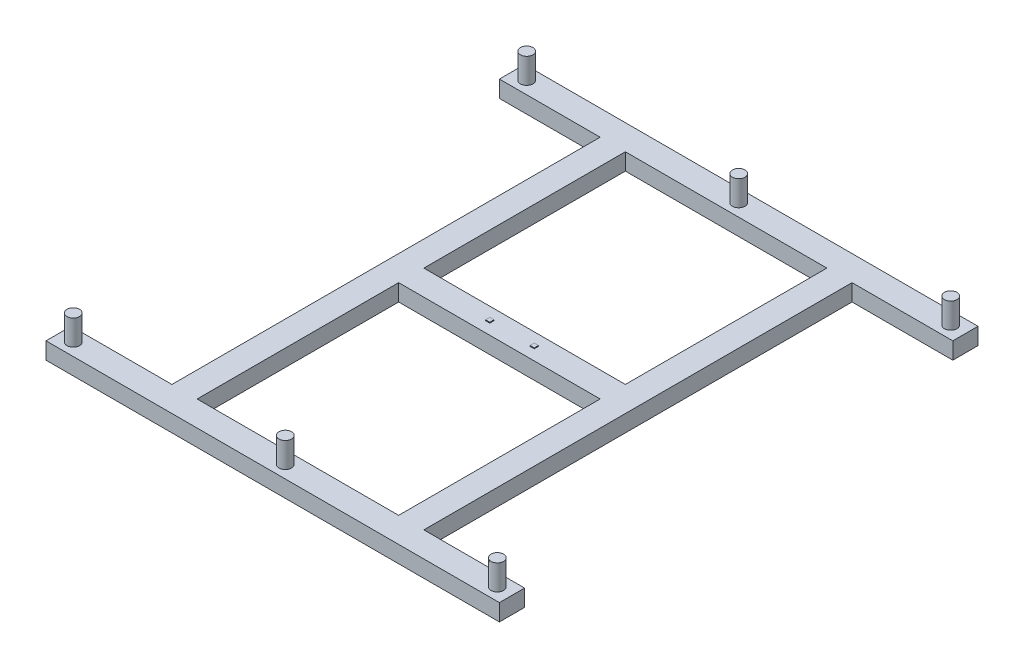
ISO-10303-21;
HEADER;
FILE_DESCRIPTION(('STEP AP214'),'2;1');
FILE_NAME('part.step','',(''),(''),'','','');
FILE_SCHEMA(('AUTOMOTIVE_DESIGN { 1 0 10303 214 1 1 1 1 }'));
ENDSEC;
DATA;
#1=APPLICATION_CONTEXT('core data for automotive mechanical design processes');
#2=APPLICATION_PROTOCOL_DEFINITION('international standard','automotive_design',2000,#1);
#3=PRODUCT_CONTEXT('',#1,'mechanical');
#4=PRODUCT('Part','Part','',(#3));
#5=PRODUCT_RELATED_PRODUCT_CATEGORY('part','',(#4));
#6=PRODUCT_DEFINITION_FORMATION('','',#4);
#7=PRODUCT_DEFINITION_CONTEXT('part definition',#1,'design');
#8=PRODUCT_DEFINITION('design','',#6,#7);
#9=PRODUCT_DEFINITION_SHAPE('','',#8);
#10=(LENGTH_UNIT() NAMED_UNIT(*) SI_UNIT(.MILLI.,.METRE.));
#11=(NAMED_UNIT(*) PLANE_ANGLE_UNIT() SI_UNIT($,.RADIAN.));
#12=(NAMED_UNIT(*) SI_UNIT($,.STERADIAN.) SOLID_ANGLE_UNIT());
#13=UNCERTAINTY_MEASURE_WITH_UNIT(LENGTH_MEASURE(1.E-05),#10,'distance_accuracy_value','');
#14=(GEOMETRIC_REPRESENTATION_CONTEXT(3) GLOBAL_UNCERTAINTY_ASSIGNED_CONTEXT((#13)) GLOBAL_UNIT_ASSIGNED_CONTEXT((#10,
#11,#12)) REPRESENTATION_CONTEXT('',''));
#15=CARTESIAN_POINT('',(0.,0.,0.));
#16=DIRECTION('',(0.,0.,1.));
#17=DIRECTION('',(1.,0.,0.));
#18=AXIS2_PLACEMENT_3D('',#15,#16,#17);
#19=CARTESIAN_POINT('',(0.,20.,0.));
#20=DIRECTION('',(0.,1.,0.));
#21=DIRECTION('',(0.,0.,1.));
#22=AXIS2_PLACEMENT_3D('',#19,#20,#21);
#23=PLANE('',#22);
#24=CARTESIAN_POINT('',(252.5,20.,270.));
#25=DIRECTION('',(0.,1.,0.));
#26=DIRECTION('',(0.,0.,1.));
#27=AXIS2_PLACEMENT_3D('',#24,#25,#26);
#28=CIRCLE('',#27,7.50000000000001);
#29=CARTESIAN_POINT('',(252.5,20.,277.5));
#30=VERTEX_POINT('',#29);
#31=EDGE_CURVE('E313',#30,#30,#28,.T.);
#32=ORIENTED_EDGE('',*,*,#31,.F.);
#33=EDGE_LOOP('',(#32));
#34=FACE_BOUND('',#33,.T.);
#35=CARTESIAN_POINT('',(0.,20.,270.));
#36=DIRECTION('',(0.,1.,0.));
#37=DIRECTION('',(0.,0.,1.));
#38=AXIS2_PLACEMENT_3D('',#35,#36,#37);
#39=CIRCLE('',#38,7.50000000000001);
#40=CARTESIAN_POINT('',(0.,20.,277.5));
#41=VERTEX_POINT('',#40);
#42=EDGE_CURVE('E321',#41,#41,#39,.T.);
#43=ORIENTED_EDGE('',*,*,#42,.F.);
#44=EDGE_LOOP('',(#43));
#45=FACE_BOUND('',#44,.T.);
#46=CARTESIAN_POINT('',(-252.5,20.,270.));
#47=DIRECTION('',(0.,1.,0.));
#48=DIRECTION('',(0.,0.,1.));
#49=AXIS2_PLACEMENT_3D('',#46,#47,#48);
#50=CIRCLE('',#49,7.50000000000001);
#51=CARTESIAN_POINT('',(-252.5,20.,277.5));
#52=VERTEX_POINT('',#51);
#53=EDGE_CURVE('E329',#52,#52,#50,.T.);
#54=ORIENTED_EDGE('',*,*,#53,.F.);
#55=EDGE_LOOP('',(#54));
#56=FACE_BOUND('',#55,.T.);
#57=CARTESIAN_POINT('',(252.5,20.,-270.));
#58=DIRECTION('',(0.,1.,0.));
#59=DIRECTION('',(0.,0.,1.));
#60=AXIS2_PLACEMENT_3D('',#57,#58,#59);
#61=CIRCLE('',#60,7.50000000000001);
#62=CARTESIAN_POINT('',(252.5,20.,-262.5));
#63=VERTEX_POINT('',#62);
#64=EDGE_CURVE('E337',#63,#63,#61,.T.);
#65=ORIENTED_EDGE('',*,*,#64,.F.);
#66=EDGE_LOOP('',(#65));
#67=FACE_BOUND('',#66,.T.);
#68=CARTESIAN_POINT('',(0.,20.,-270.));
#69=DIRECTION('',(0.,1.,0.));
#70=DIRECTION('',(0.,0.,1.));
#71=AXIS2_PLACEMENT_3D('',#68,#69,#70);
#72=CIRCLE('',#71,7.5);
#73=CARTESIAN_POINT('',(0.,20.,-262.5));
#74=VERTEX_POINT('',#73);
#75=EDGE_CURVE('E345',#74,#74,#72,.T.);
#76=ORIENTED_EDGE('',*,*,#75,.F.);
#77=EDGE_LOOP('',(#76));
#78=FACE_BOUND('',#77,.T.);
#79=CARTESIAN_POINT('',(-252.5,20.,-270.));
#80=DIRECTION('',(0.,1.,0.));
#81=DIRECTION('',(0.,0.,1.));
#82=AXIS2_PLACEMENT_3D('',#79,#80,#81);
#83=CIRCLE('',#82,7.50000000000001);
#84=CARTESIAN_POINT('',(-252.5,20.,-262.5));
#85=VERTEX_POINT('',#84);
#86=EDGE_CURVE('E349',#85,#85,#83,.T.);
#87=ORIENTED_EDGE('',*,*,#86,.F.);
#88=EDGE_LOOP('',(#87));
#89=FACE_BOUND('',#88,.T.);
#90=DIRECTION('',(0.,0.,1.));
#91=VECTOR('',#90,1.);
#92=CARTESIAN_POINT('',(150.,20.,0.));
#93=LINE('',#92,#91);
#94=CARTESIAN_POINT('',(150.,20.,-255.));
#95=VERTEX_POINT('',#94);
#96=CARTESIAN_POINT('',(150.,20.,255.));
#97=VERTEX_POINT('',#96);
#98=EDGE_CURVE('E465',#95,#97,#93,.T.);
#99=ORIENTED_EDGE('',*,*,#98,.F.);
#100=DIRECTION('',(1.,0.,0.));
#101=VECTOR('',#100,1.);
#102=CARTESIAN_POINT('',(0.,20.,-255.));
#103=LINE('',#102,#101);
#104=CARTESIAN_POINT('',(270.,20.,-255.));
#105=VERTEX_POINT('',#104);
#106=EDGE_CURVE('E443',#95,#105,#103,.T.);
#107=ORIENTED_EDGE('',*,*,#106,.T.);
#108=DIRECTION('',(0.,0.,1.));
#109=VECTOR('',#108,1.);
#110=CARTESIAN_POINT('',(269.999999999999,20.,4.9960036108132E-13));
#111=LINE('',#110,#109);
#112=CARTESIAN_POINT('',(270.,20.,-285.));
#113=VERTEX_POINT('',#112);
#114=EDGE_CURVE('E439',#113,#105,#111,.T.);
#115=ORIENTED_EDGE('',*,*,#114,.F.);
#116=DIRECTION('',(1.,0.,0.));
#117=VECTOR('',#116,1.);
#118=CARTESIAN_POINT('',(0.,20.,-285.));
#119=LINE('',#118,#117);
#120=CARTESIAN_POINT('',(-270.,20.,-285.));
#121=VERTEX_POINT('',#120);
#122=EDGE_CURVE('E469',#121,#113,#119,.T.);
#123=ORIENTED_EDGE('',*,*,#122,.F.);
#124=DIRECTION('',(0.,0.,1.));
#125=VECTOR('',#124,1.);
#126=CARTESIAN_POINT('',(-270.,20.,0.));
#127=LINE('',#126,#125);
#128=CARTESIAN_POINT('',(-270.,20.,-255.));
#129=VERTEX_POINT('',#128);
#130=EDGE_CURVE('E413',#121,#129,#127,.T.);
#131=ORIENTED_EDGE('',*,*,#130,.T.);
#132=DIRECTION('',(-1.,0.,0.));
#133=VECTOR('',#132,1.);
#134=CARTESIAN_POINT('',(0.,20.,-255.));
#135=LINE('',#134,#133);
#136=CARTESIAN_POINT('',(-150.,20.,-255.));
#137=VERTEX_POINT('',#136);
#138=EDGE_CURVE('E416',#137,#129,#135,.T.);
#139=ORIENTED_EDGE('',*,*,#138,.F.);
#140=DIRECTION('',(0.,0.,1.));
#141=VECTOR('',#140,1.);
#142=CARTESIAN_POINT('',(-150.,20.,0.));
#143=LINE('',#142,#141);
#144=CARTESIAN_POINT('',(-150.,20.,255.));
#145=VERTEX_POINT('',#144);
#146=EDGE_CURVE('E473',#137,#145,#143,.T.);
#147=ORIENTED_EDGE('',*,*,#146,.T.);
#148=DIRECTION('',(-1.,0.,0.));
#149=VECTOR('',#148,1.);
#150=CARTESIAN_POINT('',(0.,20.,255.));
#151=LINE('',#150,#149);
#152=CARTESIAN_POINT('',(-270.,20.,255.));
#153=VERTEX_POINT('',#152);
#154=EDGE_CURVE('E391',#145,#153,#151,.T.);
#155=ORIENTED_EDGE('',*,*,#154,.T.);
#156=DIRECTION('',(0.,0.,-1.));
#157=VECTOR('',#156,1.);
#158=CARTESIAN_POINT('',(-270.,20.,0.));
#159=LINE('',#158,#157);
#160=CARTESIAN_POINT('',(-270.,20.,285.));
#161=VERTEX_POINT('',#160);
#162=EDGE_CURVE('E387',#161,#153,#159,.T.);
#163=ORIENTED_EDGE('',*,*,#162,.F.);
#164=DIRECTION('',(1.,0.,0.));
#165=VECTOR('',#164,1.);
#166=CARTESIAN_POINT('',(0.,20.,285.));
#167=LINE('',#166,#165);
#168=CARTESIAN_POINT('',(270.,20.,285.));
#169=VERTEX_POINT('',#168);
#170=EDGE_CURVE('E477',#161,#169,#167,.T.);
#171=ORIENTED_EDGE('',*,*,#170,.T.);
#172=DIRECTION('',(0.,0.,-1.));
#173=VECTOR('',#172,1.);
#174=CARTESIAN_POINT('',(270.,20.,0.));
#175=LINE('',#174,#173);
#176=CARTESIAN_POINT('',(270.,20.,255.));
#177=VERTEX_POINT('',#176);
#178=EDGE_CURVE('E361',#169,#177,#175,.T.);
#179=ORIENTED_EDGE('',*,*,#178,.T.);
#180=DIRECTION('',(1.,0.,0.));
#181=VECTOR('',#180,1.);
#182=CARTESIAN_POINT('',(0.,20.,255.));
#183=LINE('',#182,#181);
#184=EDGE_CURVE('E364',#97,#177,#183,.T.);
#185=ORIENTED_EDGE('',*,*,#184,.F.);
#186=EDGE_LOOP('',(#99,#107,#115,#123,#131,#139,#147,#155,#163,#171,#179,#185));
#187=FACE_BOUND('',#186,.T.);
#188=DIRECTION('',(1.,0.,0.));
#189=VECTOR('',#188,1.);
#190=CARTESIAN_POINT('',(0.,20.,-255.));
#191=LINE('',#190,#189);
#192=CARTESIAN_POINT('',(-120.,20.,-255.));
#193=VERTEX_POINT('',#192);
#194=CARTESIAN_POINT('',(120.,20.,-255.));
#195=VERTEX_POINT('',#194);
#196=EDGE_CURVE('E480',#193,#195,#191,.T.);
#197=ORIENTED_EDGE('',*,*,#196,.T.);
#198=DIRECTION('',(0.,0.,1.));
#199=VECTOR('',#198,1.);
#200=CARTESIAN_POINT('',(120.,20.,0.));
#201=LINE('',#200,#199);
#202=CARTESIAN_POINT('',(120.,20.,-15.0000000000001));
#203=VERTEX_POINT('',#202);
#204=EDGE_CURVE('E484',#195,#203,#201,.T.);
#205=ORIENTED_EDGE('',*,*,#204,.T.);
#206=DIRECTION('',(1.,0.,0.));
#207=VECTOR('',#206,1.);
#208=CARTESIAN_POINT('',(0.,20.,-15.0000000000001));
#209=LINE('',#208,#207);
#210=CARTESIAN_POINT('',(-120.,20.,-15.0000000000001));
#211=VERTEX_POINT('',#210);
#212=EDGE_CURVE('E487',#211,#203,#209,.T.);
#213=ORIENTED_EDGE('',*,*,#212,.F.);
#214=DIRECTION('',(0.,0.,1.));
#215=VECTOR('',#214,1.);
#216=CARTESIAN_POINT('',(-120.,20.,0.));
#217=LINE('',#216,#215);
#218=EDGE_CURVE('E491',#193,#211,#217,.T.);
#219=ORIENTED_EDGE('',*,*,#218,.F.);
#220=EDGE_LOOP('',(#197,#205,#213,#219));
#221=FACE_BOUND('',#220,.T.);
#222=DIRECTION('',(1.,0.,0.));
#223=VECTOR('',#222,1.);
#224=CARTESIAN_POINT('',(0.,20.,14.9999999999999));
#225=LINE('',#224,#223);
#226=CARTESIAN_POINT('',(-120.,20.,14.9999999999999));
#227=VERTEX_POINT('',#226);
#228=CARTESIAN_POINT('',(120.,20.,14.9999999999999));
#229=VERTEX_POINT('',#228);
#230=EDGE_CURVE('E495',#227,#229,#225,.T.);
#231=ORIENTED_EDGE('',*,*,#230,.T.);
#232=DIRECTION('',(0.,0.,1.));
#233=VECTOR('',#232,1.);
#234=CARTESIAN_POINT('',(120.,20.,0.));
#235=LINE('',#234,#233);
#236=CARTESIAN_POINT('',(120.,20.,255.));
#237=VERTEX_POINT('',#236);
#238=EDGE_CURVE('E499',#229,#237,#235,.T.);
#239=ORIENTED_EDGE('',*,*,#238,.T.);
#240=DIRECTION('',(1.,0.,0.));
#241=VECTOR('',#240,1.);
#242=CARTESIAN_POINT('',(0.,20.,255.));
#243=LINE('',#242,#241);
#244=CARTESIAN_POINT('',(-120.,20.,255.));
#245=VERTEX_POINT('',#244);
#246=EDGE_CURVE('E502',#245,#237,#243,.T.);
#247=ORIENTED_EDGE('',*,*,#246,.F.);
#248=DIRECTION('',(0.,0.,1.));
#249=VECTOR('',#248,1.);
#250=CARTESIAN_POINT('',(-120.,20.,0.));
#251=LINE('',#250,#249);
#252=EDGE_CURVE('E506',#227,#245,#251,.T.);
#253=ORIENTED_EDGE('',*,*,#252,.F.);
#254=EDGE_LOOP('',(#231,#239,#247,#253));
#255=FACE_BOUND('',#254,.T.);
#256=DIRECTION('',(1.,0.,0.));
#257=VECTOR('',#256,1.);
#258=CARTESIAN_POINT('',(-29.,20.,2.50000000000083));
#259=LINE('',#258,#257);
#260=CARTESIAN_POINT('',(-29.,20.,2.50000000000083));
#261=VERTEX_POINT('',#260);
#262=CARTESIAN_POINT('',(-24.,20.,2.50000000000083));
#263=VERTEX_POINT('',#262);
#264=EDGE_CURVE('E263',#261,#263,#259,.T.);
#265=ORIENTED_EDGE('',*,*,#264,.F.);
#266=DIRECTION('',(0.,0.,1.));
#267=VECTOR('',#266,1.);
#268=CARTESIAN_POINT('',(-29.,20.,-2.49999999999917));
#269=LINE('',#268,#267);
#270=CARTESIAN_POINT('',(-29.,20.,-2.49999999999917));
#271=VERTEX_POINT('',#270);
#272=EDGE_CURVE('E258',#271,#261,#269,.T.);
#273=ORIENTED_EDGE('',*,*,#272,.F.);
#274=DIRECTION('',(-1.,0.,0.));
#275=VECTOR('',#274,1.);
#276=CARTESIAN_POINT('',(-29.,20.,-2.49999999999917));
#277=LINE('',#276,#275);
#278=CARTESIAN_POINT('',(-24.,20.,-2.49999999999917));
#279=VERTEX_POINT('',#278);
#280=EDGE_CURVE('E283',#279,#271,#277,.T.);
#281=ORIENTED_EDGE('',*,*,#280,.F.);
#282=DIRECTION('',(0.,0.,-1.));
#283=VECTOR('',#282,1.);
#284=CARTESIAN_POINT('',(-24.,20.,-2.49999999999917));
#285=LINE('',#284,#283);
#286=EDGE_CURVE('E295',#263,#279,#285,.T.);
#287=ORIENTED_EDGE('',*,*,#286,.F.);
#288=EDGE_LOOP('',(#265,#273,#281,#287));
#289=FACE_BOUND('',#288,.T.);
#290=DIRECTION('',(1.,0.,0.));
#291=VECTOR('',#290,1.);
#292=CARTESIAN_POINT('',(24.,20.,2.5));
#293=LINE('',#292,#291);
#294=CARTESIAN_POINT('',(24.,20.,2.5));
#295=VERTEX_POINT('',#294);
#296=CARTESIAN_POINT('',(29.,20.,2.5));
#297=VERTEX_POINT('',#296);
#298=EDGE_CURVE('E256',#295,#297,#293,.T.);
#299=ORIENTED_EDGE('',*,*,#298,.F.);
#300=DIRECTION('',(0.,0.,1.));
#301=VECTOR('',#300,1.);
#302=CARTESIAN_POINT('',(24.,20.,-2.5));
#303=LINE('',#302,#301);
#304=CARTESIAN_POINT('',(24.,20.,-2.5));
#305=VERTEX_POINT('',#304);
#306=EDGE_CURVE('E250',#305,#295,#303,.T.);
#307=ORIENTED_EDGE('',*,*,#306,.F.);
#308=DIRECTION('',(-1.,0.,0.));
#309=VECTOR('',#308,1.);
#310=CARTESIAN_POINT('',(24.,20.,-2.5));
#311=LINE('',#310,#309);
#312=CARTESIAN_POINT('',(29.,20.,-2.5));
#313=VERTEX_POINT('',#312);
#314=EDGE_CURVE('E234',#313,#305,#311,.T.);
#315=ORIENTED_EDGE('',*,*,#314,.F.);
#316=DIRECTION('',(0.,0.,-1.));
#317=VECTOR('',#316,1.);
#318=CARTESIAN_POINT('',(29.,20.,-2.5));
#319=LINE('',#318,#317);
#320=EDGE_CURVE('E243',#297,#313,#319,.T.);
#321=ORIENTED_EDGE('',*,*,#320,.F.);
#322=EDGE_LOOP('',(#299,#307,#315,#321));
#323=FACE_BOUND('',#322,.T.);
#324=ADVANCED_FACE('F45',(#34,#45,#56,#67,#78,#89,#187,#221,#255,#289,#323),#23,.T.);
#325=CARTESIAN_POINT('',(-150.,20.,0.));
#326=DIRECTION('',(1.,0.,0.));
#327=DIRECTION('',(0.,0.,-1.));
#328=AXIS2_PLACEMENT_3D('',#325,#326,#327);
#329=PLANE('',#328);
#330=DIRECTION('',(0.,-1.,0.));
#331=VECTOR('',#330,1.);
#332=CARTESIAN_POINT('',(-150.,20.,255.));
#333=LINE('',#332,#331);
#334=CARTESIAN_POINT('',(-150.,0.,255.));
#335=VERTEX_POINT('',#334);
#336=EDGE_CURVE('E404',#145,#335,#333,.T.);
#337=ORIENTED_EDGE('',*,*,#336,.F.);
#338=ORIENTED_EDGE('',*,*,#146,.F.);
#339=DIRECTION('',(0.,-1.,0.));
#340=VECTOR('',#339,1.);
#341=CARTESIAN_POINT('',(-150.,20.,-255.));
#342=LINE('',#341,#340);
#343=CARTESIAN_POINT('',(-150.,0.,-255.));
#344=VERTEX_POINT('',#343);
#345=EDGE_CURVE('E421',#137,#344,#342,.T.);
#346=ORIENTED_EDGE('',*,*,#345,.T.);
#347=DIRECTION('',(0.,0.,1.));
#348=VECTOR('',#347,1.);
#349=CARTESIAN_POINT('',(-150.,0.,0.));
#350=LINE('',#349,#348);
#351=EDGE_CURVE('E517',#344,#335,#350,.T.);
#352=ORIENTED_EDGE('',*,*,#351,.T.);
#353=EDGE_LOOP('',(#337,#338,#346,#352));
#354=FACE_BOUND('',#353,.T.);
#355=ADVANCED_FACE('F600',(#354),#329,.F.);
#356=CARTESIAN_POINT('',(0.,20.,14.9999999999999));
#357=DIRECTION('',(0.,0.,-1.));
#358=DIRECTION('',(-1.,0.,0.));
#359=AXIS2_PLACEMENT_3D('',#356,#357,#358);
#360=PLANE('',#359);
#361=DIRECTION('',(1.,0.,0.));
#362=VECTOR('',#361,1.);
#363=CARTESIAN_POINT('',(0.,0.,14.9999999999999));
#364=LINE('',#363,#362);
#365=CARTESIAN_POINT('',(-120.,0.,14.9999999999999));
#366=VERTEX_POINT('',#365);
#367=CARTESIAN_POINT('',(120.,0.,14.9999999999999));
#368=VERTEX_POINT('',#367);
#369=EDGE_CURVE('E539',#366,#368,#364,.T.);
#370=ORIENTED_EDGE('',*,*,#369,.T.);
#371=DIRECTION('',(0.,-1.,0.));
#372=VECTOR('',#371,1.);
#373=CARTESIAN_POINT('',(120.,20.,14.9999999999999));
#374=LINE('',#373,#372);
#375=EDGE_CURVE('E11',#229,#368,#374,.T.);
#376=ORIENTED_EDGE('',*,*,#375,.F.);
#377=ORIENTED_EDGE('',*,*,#230,.F.);
#378=DIRECTION('',(0.,-1.,0.));
#379=VECTOR('',#378,1.);
#380=CARTESIAN_POINT('',(-120.,20.,14.9999999999999));
#381=LINE('',#380,#379);
#382=EDGE_CURVE('E554',#227,#366,#381,.T.);
#383=ORIENTED_EDGE('',*,*,#382,.T.);
#384=EDGE_LOOP('',(#370,#376,#377,#383));
#385=FACE_BOUND('',#384,.T.);
#386=ADVANCED_FACE('F606',(#385),#360,.F.);
#387=CARTESIAN_POINT('',(120.,20.,0.));
#388=DIRECTION('',(1.,0.,0.));
#389=DIRECTION('',(0.,0.,-1.));
#390=AXIS2_PLACEMENT_3D('',#387,#388,#389);
#391=PLANE('',#390);
#392=DIRECTION('',(0.,0.,1.));
#393=VECTOR('',#392,1.);
#394=CARTESIAN_POINT('',(120.,0.,0.));
#395=LINE('',#394,#393);
#396=CARTESIAN_POINT('',(120.,0.,255.));
#397=VERTEX_POINT('',#396);
#398=EDGE_CURVE('E543',#368,#397,#395,.T.);
#399=ORIENTED_EDGE('',*,*,#398,.T.);
#400=DIRECTION('',(0.,-1.,0.));
#401=VECTOR('',#400,1.);
#402=CARTESIAN_POINT('',(120.,20.,255.));
#403=LINE('',#402,#401);
#404=EDGE_CURVE('E55',#237,#397,#403,.T.);
#405=ORIENTED_EDGE('',*,*,#404,.F.);
#406=ORIENTED_EDGE('',*,*,#238,.F.);
#407=ORIENTED_EDGE('',*,*,#375,.T.);
#408=EDGE_LOOP('',(#399,#405,#406,#407));
#409=FACE_BOUND('',#408,.T.);
#410=ADVANCED_FACE('F626',(#409),#391,.F.);
#411=CARTESIAN_POINT('',(0.,20.,255.));
#412=DIRECTION('',(0.,0.,-1.));
#413=DIRECTION('',(-1.,0.,0.));
#414=AXIS2_PLACEMENT_3D('',#411,#412,#413);
#415=PLANE('',#414);
#416=DIRECTION('',(1.,0.,0.));
#417=VECTOR('',#416,1.);
#418=CARTESIAN_POINT('',(0.,0.,255.));
#419=LINE('',#418,#417);
#420=CARTESIAN_POINT('',(-120.,0.,255.));
#421=VERTEX_POINT('',#420);
#422=EDGE_CURVE('E547',#421,#397,#419,.T.);
#423=ORIENTED_EDGE('',*,*,#422,.F.);
#424=DIRECTION('',(0.,-1.,0.));
#425=VECTOR('',#424,1.);
#426=CARTESIAN_POINT('',(-120.,20.,255.));
#427=LINE('',#426,#425);
#428=EDGE_CURVE('E557',#245,#421,#427,.T.);
#429=ORIENTED_EDGE('',*,*,#428,.F.);
#430=ORIENTED_EDGE('',*,*,#246,.T.);
#431=ORIENTED_EDGE('',*,*,#404,.T.);
#432=EDGE_LOOP('',(#423,#429,#430,#431));
#433=FACE_BOUND('',#432,.T.);
#434=ADVANCED_FACE('F623',(#433),#415,.T.);
#435=CARTESIAN_POINT('',(0.,20.,-255.));
#436=DIRECTION('',(0.,0.,-1.));
#437=DIRECTION('',(-1.,0.,0.));
#438=AXIS2_PLACEMENT_3D('',#435,#436,#437);
#439=PLANE('',#438);
#440=DIRECTION('',(1.,0.,0.));
#441=VECTOR('',#440,1.);
#442=CARTESIAN_POINT('',(0.,0.,-255.));
#443=LINE('',#442,#441);
#444=CARTESIAN_POINT('',(-120.,0.,-255.));
#445=VERTEX_POINT('',#444);
#446=CARTESIAN_POINT('',(120.,0.,-255.));
#447=VERTEX_POINT('',#446);
#448=EDGE_CURVE('E523',#445,#447,#443,.T.);
#449=ORIENTED_EDGE('',*,*,#448,.T.);
#450=DIRECTION('',(0.,-1.,0.));
#451=VECTOR('',#450,1.);
#452=CARTESIAN_POINT('',(120.,20.,-255.));
#453=LINE('',#452,#451);
#454=EDGE_CURVE('E49',#195,#447,#453,.T.);
#455=ORIENTED_EDGE('',*,*,#454,.F.);
#456=ORIENTED_EDGE('',*,*,#196,.F.);
#457=DIRECTION('',(0.,-1.,0.));
#458=VECTOR('',#457,1.);
#459=CARTESIAN_POINT('',(-120.,20.,-255.));
#460=LINE('',#459,#458);
#461=EDGE_CURVE('E510',#193,#445,#460,.T.);
#462=ORIENTED_EDGE('',*,*,#461,.T.);
#463=EDGE_LOOP('',(#449,#455,#456,#462));
#464=FACE_BOUND('',#463,.T.);
#465=ADVANCED_FACE('F579',(#464),#439,.F.);
#466=CARTESIAN_POINT('',(120.,20.,0.));
#467=DIRECTION('',(1.,0.,0.));
#468=DIRECTION('',(0.,0.,-1.));
#469=AXIS2_PLACEMENT_3D('',#466,#467,#468);
#470=PLANE('',#469);
#471=DIRECTION('',(0.,0.,1.));
#472=VECTOR('',#471,1.);
#473=CARTESIAN_POINT('',(120.,0.,0.));
#474=LINE('',#473,#472);
#475=CARTESIAN_POINT('',(120.,0.,-15.0000000000001));
#476=VERTEX_POINT('',#475);
#477=EDGE_CURVE('E527',#447,#476,#474,.T.);
#478=ORIENTED_EDGE('',*,*,#477,.T.);
#479=DIRECTION('',(0.,-1.,0.));
#480=VECTOR('',#479,1.);
#481=CARTESIAN_POINT('',(120.,20.,-15.0000000000001));
#482=LINE('',#481,#480);
#483=EDGE_CURVE('E566',#203,#476,#482,.T.);
#484=ORIENTED_EDGE('',*,*,#483,.F.);
#485=ORIENTED_EDGE('',*,*,#204,.F.);
#486=ORIENTED_EDGE('',*,*,#454,.T.);
#487=EDGE_LOOP('',(#478,#484,#485,#486));
#488=FACE_BOUND('',#487,.T.);
#489=ADVANCED_FACE('F575',(#488),#470,.F.);
#490=CARTESIAN_POINT('',(0.,20.,-15.0000000000001));
#491=DIRECTION('',(0.,0.,-1.));
#492=DIRECTION('',(-1.,0.,0.));
#493=AXIS2_PLACEMENT_3D('',#490,#491,#492);
#494=PLANE('',#493);
#495=DIRECTION('',(1.,0.,0.));
#496=VECTOR('',#495,1.);
#497=CARTESIAN_POINT('',(0.,0.,-15.0000000000001));
#498=LINE('',#497,#496);
#499=CARTESIAN_POINT('',(-120.,0.,-15.0000000000001));
#500=VERTEX_POINT('',#499);
#501=EDGE_CURVE('E531',#500,#476,#498,.T.);
#502=ORIENTED_EDGE('',*,*,#501,.F.);
#503=DIRECTION('',(0.,-1.,0.));
#504=VECTOR('',#503,1.);
#505=CARTESIAN_POINT('',(-120.,20.,-15.0000000000001));
#506=LINE('',#505,#504);
#507=EDGE_CURVE('E564',#211,#500,#506,.T.);
#508=ORIENTED_EDGE('',*,*,#507,.F.);
#509=ORIENTED_EDGE('',*,*,#212,.T.);
#510=ORIENTED_EDGE('',*,*,#483,.T.);
#511=EDGE_LOOP('',(#502,#508,#509,#510));
#512=FACE_BOUND('',#511,.T.);
#513=ADVANCED_FACE('F588',(#512),#494,.T.);
#514=CARTESIAN_POINT('',(150.,20.,0.));
#515=DIRECTION('',(1.,0.,0.));
#516=DIRECTION('',(0.,0.,-1.));
#517=AXIS2_PLACEMENT_3D('',#514,#515,#516);
#518=PLANE('',#517);
#519=DIRECTION('',(0.,-1.,0.));
#520=VECTOR('',#519,1.);
#521=CARTESIAN_POINT('',(150.,20.,255.));
#522=LINE('',#521,#520);
#523=CARTESIAN_POINT('',(150.,0.,255.));
#524=VERTEX_POINT('',#523);
#525=EDGE_CURVE('E369',#97,#524,#522,.T.);
#526=ORIENTED_EDGE('',*,*,#525,.T.);
#527=DIRECTION('',(0.,0.,1.));
#528=VECTOR('',#527,1.);
#529=CARTESIAN_POINT('',(150.,0.,0.));
#530=LINE('',#529,#528);
#531=CARTESIAN_POINT('',(150.,0.,-255.));
#532=VERTEX_POINT('',#531);
#533=EDGE_CURVE('E464',#532,#524,#530,.T.);
#534=ORIENTED_EDGE('',*,*,#533,.F.);
#535=DIRECTION('',(0.,-1.,0.));
#536=VECTOR('',#535,1.);
#537=CARTESIAN_POINT('',(150.,20.,-255.));
#538=LINE('',#537,#536);
#539=EDGE_CURVE('E456',#95,#532,#538,.T.);
#540=ORIENTED_EDGE('',*,*,#539,.F.);
#541=ORIENTED_EDGE('',*,*,#98,.T.);
#542=EDGE_LOOP('',(#526,#534,#540,#541));
#543=FACE_BOUND('',#542,.T.);
#544=ADVANCED_FACE('F47',(#543),#518,.T.);
#545=CARTESIAN_POINT('',(0.,20.,-285.));
#546=DIRECTION('',(0.,0.,-1.));
#547=DIRECTION('',(-1.,0.,0.));
#548=AXIS2_PLACEMENT_3D('',#545,#546,#547);
#549=PLANE('',#548);
#550=DIRECTION('',(1.,0.,0.));
#551=VECTOR('',#550,1.);
#552=CARTESIAN_POINT('',(0.,0.,-285.));
#553=LINE('',#552,#551);
#554=CARTESIAN_POINT('',(-270.,0.,-285.));
#555=VERTEX_POINT('',#554);
#556=CARTESIAN_POINT('',(270.,0.,-285.));
#557=VERTEX_POINT('',#556);
#558=EDGE_CURVE('E514',#555,#557,#553,.T.);
#559=ORIENTED_EDGE('',*,*,#558,.F.);
#560=DIRECTION('',(0.,-1.,0.));
#561=VECTOR('',#560,1.);
#562=CARTESIAN_POINT('',(-270.,20.,-285.));
#563=LINE('',#562,#561);
#564=EDGE_CURVE('E434',#121,#555,#563,.T.);
#565=ORIENTED_EDGE('',*,*,#564,.F.);
#566=ORIENTED_EDGE('',*,*,#122,.T.);
#567=DIRECTION('',(0.,-1.,0.));
#568=VECTOR('',#567,1.);
#569=CARTESIAN_POINT('',(270.,20.,-285.));
#570=LINE('',#569,#568);
#571=EDGE_CURVE('E460',#113,#557,#570,.T.);
#572=ORIENTED_EDGE('',*,*,#571,.T.);
#573=EDGE_LOOP('',(#559,#565,#566,#572));
#574=FACE_BOUND('',#573,.T.);
#575=ADVANCED_FACE('F595',(#574),#549,.T.);
#576=CARTESIAN_POINT('',(-120.,20.,0.));
#577=DIRECTION('',(1.,0.,0.));
#578=DIRECTION('',(0.,0.,-1.));
#579=AXIS2_PLACEMENT_3D('',#576,#577,#578);
#580=PLANE('',#579);
#581=DIRECTION('',(0.,0.,1.));
#582=VECTOR('',#581,1.);
#583=CARTESIAN_POINT('',(-120.,0.,0.));
#584=LINE('',#583,#582);
#585=EDGE_CURVE('E535',#445,#500,#584,.T.);
#586=ORIENTED_EDGE('',*,*,#585,.F.);
#587=ORIENTED_EDGE('',*,*,#461,.F.);
#588=ORIENTED_EDGE('',*,*,#218,.T.);
#589=ORIENTED_EDGE('',*,*,#507,.T.);
#590=EDGE_LOOP('',(#586,#587,#588,#589));
#591=FACE_BOUND('',#590,.T.);
#592=ADVANCED_FACE('F585',(#591),#580,.T.);
#593=CARTESIAN_POINT('',(0.,20.,285.));
#594=DIRECTION('',(0.,0.,-1.));
#595=DIRECTION('',(-1.,0.,0.));
#596=AXIS2_PLACEMENT_3D('',#593,#594,#595);
#597=PLANE('',#596);
#598=DIRECTION('',(1.,0.,0.));
#599=VECTOR('',#598,1.);
#600=CARTESIAN_POINT('',(0.,0.,285.));
#601=LINE('',#600,#599);
#602=CARTESIAN_POINT('',(-270.,0.,285.));
#603=VERTEX_POINT('',#602);
#604=CARTESIAN_POINT('',(270.,0.,285.));
#605=VERTEX_POINT('',#604);
#606=EDGE_CURVE('E520',#603,#605,#601,.T.);
#607=ORIENTED_EDGE('',*,*,#606,.T.);
#608=DIRECTION('',(0.,-1.,0.));
#609=VECTOR('',#608,1.);
#610=CARTESIAN_POINT('',(270.,20.,285.));
#611=LINE('',#610,#609);
#612=EDGE_CURVE('E382',#169,#605,#611,.T.);
#613=ORIENTED_EDGE('',*,*,#612,.F.);
#614=ORIENTED_EDGE('',*,*,#170,.F.);
#615=DIRECTION('',(0.,-1.,0.));
#616=VECTOR('',#615,1.);
#617=CARTESIAN_POINT('',(-270.,20.,285.));
#618=LINE('',#617,#616);
#619=EDGE_CURVE('E408',#161,#603,#618,.T.);
#620=ORIENTED_EDGE('',*,*,#619,.T.);
#621=EDGE_LOOP('',(#607,#613,#614,#620));
#622=FACE_BOUND('',#621,.T.);
#623=ADVANCED_FACE('F621',(#622),#597,.F.);
#624=CARTESIAN_POINT('',(-120.,20.,0.));
#625=DIRECTION('',(1.,0.,0.));
#626=DIRECTION('',(0.,0.,-1.));
#627=AXIS2_PLACEMENT_3D('',#624,#625,#626);
#628=PLANE('',#627);
#629=DIRECTION('',(0.,0.,1.));
#630=VECTOR('',#629,1.);
#631=CARTESIAN_POINT('',(-120.,0.,0.));
#632=LINE('',#631,#630);
#633=EDGE_CURVE('E470',#366,#421,#632,.T.);
#634=ORIENTED_EDGE('',*,*,#633,.F.);
#635=ORIENTED_EDGE('',*,*,#382,.F.);
#636=ORIENTED_EDGE('',*,*,#252,.T.);
#637=ORIENTED_EDGE('',*,*,#428,.T.);
#638=EDGE_LOOP('',(#634,#635,#636,#637));
#639=FACE_BOUND('',#638,.T.);
#640=ADVANCED_FACE('F617',(#639),#628,.T.);
#641=CARTESIAN_POINT('',(0.,0.,0.));
#642=DIRECTION('',(0.,1.,0.));
#643=DIRECTION('',(0.,0.,1.));
#644=AXIS2_PLACEMENT_3D('',#641,#642,#643);
#645=PLANE('',#644);
#646=ORIENTED_EDGE('',*,*,#558,.T.);
#647=DIRECTION('',(0.,0.,1.));
#648=VECTOR('',#647,1.);
#649=CARTESIAN_POINT('',(269.999999999999,0.,4.9960036108132E-13));
#650=LINE('',#649,#648);
#651=CARTESIAN_POINT('',(270.,0.,-255.));
#652=VERTEX_POINT('',#651);
#653=EDGE_CURVE('E438',#557,#652,#650,.T.);
#654=ORIENTED_EDGE('',*,*,#653,.T.);
#655=DIRECTION('',(1.,0.,0.));
#656=VECTOR('',#655,1.);
#657=CARTESIAN_POINT('',(0.,0.,-255.));
#658=LINE('',#657,#656);
#659=EDGE_CURVE('E444',#532,#652,#658,.T.);
#660=ORIENTED_EDGE('',*,*,#659,.F.);
#661=ORIENTED_EDGE('',*,*,#533,.T.);
#662=DIRECTION('',(1.,0.,0.));
#663=VECTOR('',#662,1.);
#664=CARTESIAN_POINT('',(0.,0.,255.));
#665=LINE('',#664,#663);
#666=CARTESIAN_POINT('',(270.,0.,255.));
#667=VERTEX_POINT('',#666);
#668=EDGE_CURVE('E365',#524,#667,#665,.T.);
#669=ORIENTED_EDGE('',*,*,#668,.T.);
#670=DIRECTION('',(0.,0.,-1.));
#671=VECTOR('',#670,1.);
#672=CARTESIAN_POINT('',(270.,0.,0.));
#673=LINE('',#672,#671);
#674=EDGE_CURVE('E357',#605,#667,#673,.T.);
#675=ORIENTED_EDGE('',*,*,#674,.F.);
#676=ORIENTED_EDGE('',*,*,#606,.F.);
#677=DIRECTION('',(0.,0.,-1.));
#678=VECTOR('',#677,1.);
#679=CARTESIAN_POINT('',(-270.,0.,0.));
#680=LINE('',#679,#678);
#681=CARTESIAN_POINT('',(-270.,0.,255.));
#682=VERTEX_POINT('',#681);
#683=EDGE_CURVE('E386',#603,#682,#680,.T.);
#684=ORIENTED_EDGE('',*,*,#683,.T.);
#685=DIRECTION('',(-1.,0.,0.));
#686=VECTOR('',#685,1.);
#687=CARTESIAN_POINT('',(0.,0.,255.));
#688=LINE('',#687,#686);
#689=EDGE_CURVE('E392',#335,#682,#688,.T.);
#690=ORIENTED_EDGE('',*,*,#689,.F.);
#691=ORIENTED_EDGE('',*,*,#351,.F.);
#692=DIRECTION('',(-1.,0.,0.));
#693=VECTOR('',#692,1.);
#694=CARTESIAN_POINT('',(0.,0.,-255.));
#695=LINE('',#694,#693);
#696=CARTESIAN_POINT('',(-270.,0.,-255.));
#697=VERTEX_POINT('',#696);
#698=EDGE_CURVE('E417',#344,#697,#695,.T.);
#699=ORIENTED_EDGE('',*,*,#698,.T.);
#700=DIRECTION('',(0.,0.,1.));
#701=VECTOR('',#700,1.);
#702=CARTESIAN_POINT('',(-270.,0.,0.));
#703=LINE('',#702,#701);
#704=EDGE_CURVE('E412',#555,#697,#703,.T.);
#705=ORIENTED_EDGE('',*,*,#704,.F.);
#706=EDGE_LOOP('',(#646,#654,#660,#661,#669,#675,#676,#684,#690,#691,#699,#705));
#707=FACE_BOUND('',#706,.T.);
#708=ORIENTED_EDGE('',*,*,#448,.F.);
#709=ORIENTED_EDGE('',*,*,#585,.T.);
#710=ORIENTED_EDGE('',*,*,#501,.T.);
#711=ORIENTED_EDGE('',*,*,#477,.F.);
#712=EDGE_LOOP('',(#708,#709,#710,#711));
#713=FACE_BOUND('',#712,.T.);
#714=ORIENTED_EDGE('',*,*,#369,.F.);
#715=ORIENTED_EDGE('',*,*,#633,.T.);
#716=ORIENTED_EDGE('',*,*,#422,.T.);
#717=ORIENTED_EDGE('',*,*,#398,.F.);
#718=EDGE_LOOP('',(#714,#715,#716,#717));
#719=FACE_BOUND('',#718,.T.);
#720=ADVANCED_FACE('F582',(#707,#713,#719),#645,.F.);
#721=CARTESIAN_POINT('',(269.999999999999,20.,4.9960036108132E-13));
#722=DIRECTION('',(1.,0.,0.));
#723=DIRECTION('',(0.,0.,-1.));
#724=AXIS2_PLACEMENT_3D('',#721,#722,#723);
#725=PLANE('',#724);
#726=ORIENTED_EDGE('',*,*,#653,.F.);
#727=ORIENTED_EDGE('',*,*,#571,.F.);
#728=ORIENTED_EDGE('',*,*,#114,.T.);
#729=DIRECTION('',(0.,-1.,0.));
#730=VECTOR('',#729,1.);
#731=CARTESIAN_POINT('',(270.,20.,-255.));
#732=LINE('',#731,#730);
#733=EDGE_CURVE('E447',#105,#652,#732,.T.);
#734=ORIENTED_EDGE('',*,*,#733,.T.);
#735=EDGE_LOOP('',(#726,#727,#728,#734));
#736=FACE_BOUND('',#735,.T.);
#737=ADVANCED_FACE('F613',(#736),#725,.T.);
#738=CARTESIAN_POINT('',(0.,20.,-255.));
#739=DIRECTION('',(0.,0.,-1.));
#740=DIRECTION('',(-1.,0.,0.));
#741=AXIS2_PLACEMENT_3D('',#738,#739,#740);
#742=PLANE('',#741);
#743=ORIENTED_EDGE('',*,*,#659,.T.);
#744=ORIENTED_EDGE('',*,*,#733,.F.);
#745=ORIENTED_EDGE('',*,*,#106,.F.);
#746=ORIENTED_EDGE('',*,*,#539,.T.);
#747=EDGE_LOOP('',(#743,#744,#745,#746));
#748=FACE_BOUND('',#747,.T.);
#749=ADVANCED_FACE('F718',(#748),#742,.F.);
#750=CARTESIAN_POINT('',(-270.,20.,0.));
#751=DIRECTION('',(1.,0.,0.));
#752=DIRECTION('',(0.,0.,-1.));
#753=AXIS2_PLACEMENT_3D('',#750,#751,#752);
#754=PLANE('',#753);
#755=ORIENTED_EDGE('',*,*,#704,.T.);
#756=DIRECTION('',(0.,-1.,0.));
#757=VECTOR('',#756,1.);
#758=CARTESIAN_POINT('',(-270.,20.,-255.));
#759=LINE('',#758,#757);
#760=EDGE_CURVE('E431',#129,#697,#759,.T.);
#761=ORIENTED_EDGE('',*,*,#760,.F.);
#762=ORIENTED_EDGE('',*,*,#130,.F.);
#763=ORIENTED_EDGE('',*,*,#564,.T.);
#764=EDGE_LOOP('',(#755,#761,#762,#763));
#765=FACE_BOUND('',#764,.T.);
#766=ADVANCED_FACE('F727',(#765),#754,.F.);
#767=CARTESIAN_POINT('',(0.,20.,-255.));
#768=DIRECTION('',(0.,0.,1.));
#769=DIRECTION('',(1.,0.,0.));
#770=AXIS2_PLACEMENT_3D('',#767,#768,#769);
#771=PLANE('',#770);
#772=ORIENTED_EDGE('',*,*,#698,.F.);
#773=ORIENTED_EDGE('',*,*,#345,.F.);
#774=ORIENTED_EDGE('',*,*,#138,.T.);
#775=ORIENTED_EDGE('',*,*,#760,.T.);
#776=EDGE_LOOP('',(#772,#773,#774,#775));
#777=FACE_BOUND('',#776,.T.);
#778=ADVANCED_FACE('F737',(#777),#771,.T.);
#779=CARTESIAN_POINT('',(-270.,20.,0.));
#780=DIRECTION('',(-1.,0.,0.));
#781=DIRECTION('',(0.,0.,1.));
#782=AXIS2_PLACEMENT_3D('',#779,#780,#781);
#783=PLANE('',#782);
#784=ORIENTED_EDGE('',*,*,#683,.F.);
#785=ORIENTED_EDGE('',*,*,#619,.F.);
#786=ORIENTED_EDGE('',*,*,#162,.T.);
#787=DIRECTION('',(0.,-1.,0.));
#788=VECTOR('',#787,1.);
#789=CARTESIAN_POINT('',(-270.,20.,255.));
#790=LINE('',#789,#788);
#791=EDGE_CURVE('E395',#153,#682,#790,.T.);
#792=ORIENTED_EDGE('',*,*,#791,.T.);
#793=EDGE_LOOP('',(#784,#785,#786,#792));
#794=FACE_BOUND('',#793,.T.);
#795=ADVANCED_FACE('F748',(#794),#783,.T.);
#796=CARTESIAN_POINT('',(0.,20.,255.));
#797=DIRECTION('',(0.,0.,1.));
#798=DIRECTION('',(1.,0.,0.));
#799=AXIS2_PLACEMENT_3D('',#796,#797,#798);
#800=PLANE('',#799);
#801=ORIENTED_EDGE('',*,*,#689,.T.);
#802=ORIENTED_EDGE('',*,*,#791,.F.);
#803=ORIENTED_EDGE('',*,*,#154,.F.);
#804=ORIENTED_EDGE('',*,*,#336,.T.);
#805=EDGE_LOOP('',(#801,#802,#803,#804));
#806=FACE_BOUND('',#805,.T.);
#807=ADVANCED_FACE('F759',(#806),#800,.F.);
#808=CARTESIAN_POINT('',(270.,20.,0.));
#809=DIRECTION('',(-1.,0.,0.));
#810=DIRECTION('',(0.,0.,1.));
#811=AXIS2_PLACEMENT_3D('',#808,#809,#810);
#812=PLANE('',#811);
#813=ORIENTED_EDGE('',*,*,#674,.T.);
#814=DIRECTION('',(0.,-1.,0.));
#815=VECTOR('',#814,1.);
#816=CARTESIAN_POINT('',(270.,20.,255.));
#817=LINE('',#816,#815);
#818=EDGE_CURVE('E379',#177,#667,#817,.T.);
#819=ORIENTED_EDGE('',*,*,#818,.F.);
#820=ORIENTED_EDGE('',*,*,#178,.F.);
#821=ORIENTED_EDGE('',*,*,#612,.T.);
#822=EDGE_LOOP('',(#813,#819,#820,#821));
#823=FACE_BOUND('',#822,.T.);
#824=ADVANCED_FACE('F770',(#823),#812,.F.);
#825=CARTESIAN_POINT('',(0.,20.,255.));
#826=DIRECTION('',(0.,0.,-1.));
#827=DIRECTION('',(-1.,0.,0.));
#828=AXIS2_PLACEMENT_3D('',#825,#826,#827);
#829=PLANE('',#828);
#830=ORIENTED_EDGE('',*,*,#668,.F.);
#831=ORIENTED_EDGE('',*,*,#525,.F.);
#832=ORIENTED_EDGE('',*,*,#184,.T.);
#833=ORIENTED_EDGE('',*,*,#818,.T.);
#834=EDGE_LOOP('',(#830,#831,#832,#833));
#835=FACE_BOUND('',#834,.T.);
#836=ADVANCED_FACE('F781',(#835),#829,.T.);
#837=CARTESIAN_POINT('',(-252.5,50.,-270.));
#838=DIRECTION('',(0.,-1.,0.));
#839=DIRECTION('',(0.,0.,-1.));
#840=AXIS2_PLACEMENT_3D('',#837,#838,#839);
#841=CYLINDRICAL_SURFACE('',#840,7.50000000000001);
#842=CARTESIAN_POINT('',(-252.5,50.,-270.));
#843=DIRECTION('',(0.,1.,0.));
#844=DIRECTION('',(0.,0.,1.));
#845=AXIS2_PLACEMENT_3D('',#842,#843,#844);
#846=CIRCLE('',#845,7.50000000000001);
#847=CARTESIAN_POINT('',(-252.5,50.,-262.5));
#848=VERTEX_POINT('',#847);
#849=EDGE_CURVE('E353',#848,#848,#846,.T.);
#850=ORIENTED_EDGE('',*,*,#849,.F.);
#851=EDGE_LOOP('',(#850));
#852=FACE_BOUND('',#851,.T.);
#853=ORIENTED_EDGE('',*,*,#86,.T.);
#854=EDGE_LOOP('',(#853));
#855=FACE_BOUND('',#854,.T.);
#856=ADVANCED_FACE('F792',(#852,#855),#841,.T.);
#857=CARTESIAN_POINT('',(-252.5,50.,-270.));
#858=DIRECTION('',(0.,1.,0.));
#859=DIRECTION('',(0.,0.,1.));
#860=AXIS2_PLACEMENT_3D('',#857,#858,#859);
#861=PLANE('',#860);
#862=ORIENTED_EDGE('',*,*,#849,.T.);
#863=EDGE_LOOP('',(#862));
#864=FACE_BOUND('',#863,.T.);
#865=ADVANCED_FACE('F803',(#864),#861,.T.);
#866=CARTESIAN_POINT('',(0.,50.,-270.));
#867=DIRECTION('',(0.,-1.,0.));
#868=DIRECTION('',(0.,0.,-1.));
#869=AXIS2_PLACEMENT_3D('',#866,#867,#868);
#870=CYLINDRICAL_SURFACE('',#869,7.5);
#871=CARTESIAN_POINT('',(0.,50.,-270.));
#872=DIRECTION('',(0.,1.,0.));
#873=DIRECTION('',(0.,0.,1.));
#874=AXIS2_PLACEMENT_3D('',#871,#872,#873);
#875=CIRCLE('',#874,7.5);
#876=CARTESIAN_POINT('',(0.,50.,-262.5));
#877=VERTEX_POINT('',#876);
#878=EDGE_CURVE('E341',#877,#877,#875,.T.);
#879=ORIENTED_EDGE('',*,*,#878,.F.);
#880=EDGE_LOOP('',(#879));
#881=FACE_BOUND('',#880,.T.);
#882=ORIENTED_EDGE('',*,*,#75,.T.);
#883=EDGE_LOOP('',(#882));
#884=FACE_BOUND('',#883,.T.);
#885=ADVANCED_FACE('F814',(#881,#884),#870,.T.);
#886=CARTESIAN_POINT('',(0.,50.,-270.));
#887=DIRECTION('',(0.,1.,0.));
#888=DIRECTION('',(0.,0.,1.));
#889=AXIS2_PLACEMENT_3D('',#886,#887,#888);
#890=PLANE('',#889);
#891=ORIENTED_EDGE('',*,*,#878,.T.);
#892=EDGE_LOOP('',(#891));
#893=FACE_BOUND('',#892,.T.);
#894=ADVANCED_FACE('F825',(#893),#890,.T.);
#895=CARTESIAN_POINT('',(252.5,50.,-270.));
#896=DIRECTION('',(0.,-1.,0.));
#897=DIRECTION('',(0.,0.,-1.));
#898=AXIS2_PLACEMENT_3D('',#895,#896,#897);
#899=CYLINDRICAL_SURFACE('',#898,7.50000000000001);
#900=CARTESIAN_POINT('',(252.5,50.,-270.));
#901=DIRECTION('',(0.,1.,0.));
#902=DIRECTION('',(0.,0.,1.));
#903=AXIS2_PLACEMENT_3D('',#900,#901,#902);
#904=CIRCLE('',#903,7.50000000000001);
#905=CARTESIAN_POINT('',(252.5,50.,-262.5));
#906=VERTEX_POINT('',#905);
#907=EDGE_CURVE('E333',#906,#906,#904,.T.);
#908=ORIENTED_EDGE('',*,*,#907,.F.);
#909=EDGE_LOOP('',(#908));
#910=FACE_BOUND('',#909,.T.);
#911=ORIENTED_EDGE('',*,*,#64,.T.);
#912=EDGE_LOOP('',(#911));
#913=FACE_BOUND('',#912,.T.);
#914=ADVANCED_FACE('F836',(#910,#913),#899,.T.);
#915=CARTESIAN_POINT('',(252.5,50.,-270.));
#916=DIRECTION('',(0.,1.,0.));
#917=DIRECTION('',(0.,0.,1.));
#918=AXIS2_PLACEMENT_3D('',#915,#916,#917);
#919=PLANE('',#918);
#920=ORIENTED_EDGE('',*,*,#907,.T.);
#921=EDGE_LOOP('',(#920));
#922=FACE_BOUND('',#921,.T.);
#923=ADVANCED_FACE('F847',(#922),#919,.T.);
#924=CARTESIAN_POINT('',(-252.5,50.,270.));
#925=DIRECTION('',(0.,-1.,0.));
#926=DIRECTION('',(0.,0.,-1.));
#927=AXIS2_PLACEMENT_3D('',#924,#925,#926);
#928=CYLINDRICAL_SURFACE('',#927,7.50000000000001);
#929=CARTESIAN_POINT('',(-252.5,50.,270.));
#930=DIRECTION('',(0.,1.,0.));
#931=DIRECTION('',(0.,0.,1.));
#932=AXIS2_PLACEMENT_3D('',#929,#930,#931);
#933=CIRCLE('',#932,7.50000000000001);
#934=CARTESIAN_POINT('',(-252.5,50.,277.5));
#935=VERTEX_POINT('',#934);
#936=EDGE_CURVE('E325',#935,#935,#933,.T.);
#937=ORIENTED_EDGE('',*,*,#936,.F.);
#938=EDGE_LOOP('',(#937));
#939=FACE_BOUND('',#938,.T.);
#940=ORIENTED_EDGE('',*,*,#53,.T.);
#941=EDGE_LOOP('',(#940));
#942=FACE_BOUND('',#941,.T.);
#943=ADVANCED_FACE('F858',(#939,#942),#928,.T.);
#944=CARTESIAN_POINT('',(-252.5,50.,270.));
#945=DIRECTION('',(0.,1.,0.));
#946=DIRECTION('',(0.,0.,1.));
#947=AXIS2_PLACEMENT_3D('',#944,#945,#946);
#948=PLANE('',#947);
#949=ORIENTED_EDGE('',*,*,#936,.T.);
#950=EDGE_LOOP('',(#949));
#951=FACE_BOUND('',#950,.T.);
#952=ADVANCED_FACE('F869',(#951),#948,.T.);
#953=CARTESIAN_POINT('',(0.,50.,270.));
#954=DIRECTION('',(0.,-1.,0.));
#955=DIRECTION('',(0.,0.,-1.));
#956=AXIS2_PLACEMENT_3D('',#953,#954,#955);
#957=CYLINDRICAL_SURFACE('',#956,7.50000000000001);
#958=CARTESIAN_POINT('',(0.,50.,270.));
#959=DIRECTION('',(0.,1.,0.));
#960=DIRECTION('',(0.,0.,1.));
#961=AXIS2_PLACEMENT_3D('',#958,#959,#960);
#962=CIRCLE('',#961,7.50000000000001);
#963=CARTESIAN_POINT('',(0.,50.,277.5));
#964=VERTEX_POINT('',#963);
#965=EDGE_CURVE('E317',#964,#964,#962,.T.);
#966=ORIENTED_EDGE('',*,*,#965,.F.);
#967=EDGE_LOOP('',(#966));
#968=FACE_BOUND('',#967,.T.);
#969=ORIENTED_EDGE('',*,*,#42,.T.);
#970=EDGE_LOOP('',(#969));
#971=FACE_BOUND('',#970,.T.);
#972=ADVANCED_FACE('F880',(#968,#971),#957,.T.);
#973=CARTESIAN_POINT('',(0.,50.,270.));
#974=DIRECTION('',(0.,1.,0.));
#975=DIRECTION('',(0.,0.,1.));
#976=AXIS2_PLACEMENT_3D('',#973,#974,#975);
#977=PLANE('',#976);
#978=ORIENTED_EDGE('',*,*,#965,.T.);
#979=EDGE_LOOP('',(#978));
#980=FACE_BOUND('',#979,.T.);
#981=ADVANCED_FACE('F891',(#980),#977,.T.);
#982=CARTESIAN_POINT('',(252.5,50.,270.));
#983=DIRECTION('',(0.,-1.,0.));
#984=DIRECTION('',(0.,0.,-1.));
#985=AXIS2_PLACEMENT_3D('',#982,#983,#984);
#986=CYLINDRICAL_SURFACE('',#985,7.50000000000001);
#987=CARTESIAN_POINT('',(252.5,50.,270.));
#988=DIRECTION('',(0.,1.,0.));
#989=DIRECTION('',(0.,0.,1.));
#990=AXIS2_PLACEMENT_3D('',#987,#988,#989);
#991=CIRCLE('',#990,7.50000000000001);
#992=CARTESIAN_POINT('',(252.5,50.,277.5));
#993=VERTEX_POINT('',#992);
#994=EDGE_CURVE('E312',#993,#993,#991,.T.);
#995=ORIENTED_EDGE('',*,*,#994,.F.);
#996=EDGE_LOOP('',(#995));
#997=FACE_BOUND('',#996,.T.);
#998=ORIENTED_EDGE('',*,*,#31,.T.);
#999=EDGE_LOOP('',(#998));
#1000=FACE_BOUND('',#999,.T.);
#1001=ADVANCED_FACE('F902',(#997,#1000),#986,.T.);
#1002=CARTESIAN_POINT('',(252.5,50.,270.));
#1003=DIRECTION('',(0.,1.,0.));
#1004=DIRECTION('',(0.,0.,1.));
#1005=AXIS2_PLACEMENT_3D('',#1002,#1003,#1004);
#1006=PLANE('',#1005);
#1007=ORIENTED_EDGE('',*,*,#994,.T.);
#1008=EDGE_LOOP('',(#1007));
#1009=FACE_BOUND('',#1008,.T.);
#1010=ADVANCED_FACE('F913',(#1009),#1006,.T.);
#1011=CARTESIAN_POINT('',(-29.,21.,-2.49999999999917));
#1012=DIRECTION('',(1.,0.,0.));
#1013=DIRECTION('',(0.,0.,-1.));
#1014=AXIS2_PLACEMENT_3D('',#1011,#1012,#1013);
#1015=PLANE('',#1014);
#1016=ORIENTED_EDGE('',*,*,#272,.T.);
#1017=DIRECTION('',(0.,-1.,0.));
#1018=VECTOR('',#1017,1.);
#1019=CARTESIAN_POINT('',(-29.,21.,2.50000000000083));
#1020=LINE('',#1019,#1018);
#1021=CARTESIAN_POINT('',(-29.,21.,2.50000000000083));
#1022=VERTEX_POINT('',#1021);
#1023=EDGE_CURVE('E309',#1022,#261,#1020,.T.);
#1024=ORIENTED_EDGE('',*,*,#1023,.F.);
#1025=DIRECTION('',(0.,0.,1.));
#1026=VECTOR('',#1025,1.);
#1027=CARTESIAN_POINT('',(-29.,21.,-2.49999999999917));
#1028=LINE('',#1027,#1026);
#1029=CARTESIAN_POINT('',(-29.,21.,-2.49999999999917));
#1030=VERTEX_POINT('',#1029);
#1031=EDGE_CURVE('E278',#1030,#1022,#1028,.T.);
#1032=ORIENTED_EDGE('',*,*,#1031,.F.);
#1033=DIRECTION('',(0.,-1.,0.));
#1034=VECTOR('',#1033,1.);
#1035=CARTESIAN_POINT('',(-29.,21.,-2.49999999999917));
#1036=LINE('',#1035,#1034);
#1037=EDGE_CURVE('E291',#1030,#271,#1036,.T.);
#1038=ORIENTED_EDGE('',*,*,#1037,.T.);
#1039=EDGE_LOOP('',(#1016,#1024,#1032,#1038));
#1040=FACE_BOUND('',#1039,.T.);
#1041=ADVANCED_FACE('F923',(#1040),#1015,.F.);
#1042=CARTESIAN_POINT('',(-29.,21.,2.50000000000083));
#1043=DIRECTION('',(0.,0.,-1.));
#1044=DIRECTION('',(-1.,0.,0.));
#1045=AXIS2_PLACEMENT_3D('',#1042,#1043,#1044);
#1046=PLANE('',#1045);
#1047=ORIENTED_EDGE('',*,*,#264,.T.);
#1048=DIRECTION('',(0.,-1.,0.));
#1049=VECTOR('',#1048,1.);
#1050=CARTESIAN_POINT('',(-24.,21.,2.50000000000083));
#1051=LINE('',#1050,#1049);
#1052=CARTESIAN_POINT('',(-24.,21.,2.50000000000083));
#1053=VERTEX_POINT('',#1052);
#1054=EDGE_CURVE('E305',#1053,#263,#1051,.T.);
#1055=ORIENTED_EDGE('',*,*,#1054,.F.);
#1056=DIRECTION('',(1.,0.,0.));
#1057=VECTOR('',#1056,1.);
#1058=CARTESIAN_POINT('',(-29.,21.,2.50000000000083));
#1059=LINE('',#1058,#1057);
#1060=EDGE_CURVE('E282',#1022,#1053,#1059,.T.);
#1061=ORIENTED_EDGE('',*,*,#1060,.F.);
#1062=ORIENTED_EDGE('',*,*,#1023,.T.);
#1063=EDGE_LOOP('',(#1047,#1055,#1061,#1062));
#1064=FACE_BOUND('',#1063,.T.);
#1065=ADVANCED_FACE('F941',(#1064),#1046,.F.);
#1066=CARTESIAN_POINT('',(-24.,21.,-2.49999999999917));
#1067=DIRECTION('',(-1.,0.,0.));
#1068=DIRECTION('',(0.,0.,1.));
#1069=AXIS2_PLACEMENT_3D('',#1066,#1067,#1068);
#1070=PLANE('',#1069);
#1071=ORIENTED_EDGE('',*,*,#286,.T.);
#1072=DIRECTION('',(0.,-1.,0.));
#1073=VECTOR('',#1072,1.);
#1074=CARTESIAN_POINT('',(-24.,21.,-2.49999999999917));
#1075=LINE('',#1074,#1073);
#1076=CARTESIAN_POINT('',(-24.,21.,-2.49999999999917));
#1077=VERTEX_POINT('',#1076);
#1078=EDGE_CURVE('E71',#1077,#279,#1075,.T.);
#1079=ORIENTED_EDGE('',*,*,#1078,.F.);
#1080=DIRECTION('',(0.,0.,-1.));
#1081=VECTOR('',#1080,1.);
#1082=CARTESIAN_POINT('',(-24.,21.,-2.49999999999917));
#1083=LINE('',#1082,#1081);
#1084=EDGE_CURVE('E286',#1053,#1077,#1083,.T.);
#1085=ORIENTED_EDGE('',*,*,#1084,.F.);
#1086=ORIENTED_EDGE('',*,*,#1054,.T.);
#1087=EDGE_LOOP('',(#1071,#1079,#1085,#1086));
#1088=FACE_BOUND('',#1087,.T.);
#1089=ADVANCED_FACE('F952',(#1088),#1070,.F.);
#1090=CARTESIAN_POINT('',(-29.,21.,-2.49999999999917));
#1091=DIRECTION('',(0.,0.,1.));
#1092=DIRECTION('',(1.,0.,0.));
#1093=AXIS2_PLACEMENT_3D('',#1090,#1091,#1092);
#1094=PLANE('',#1093);
#1095=ORIENTED_EDGE('',*,*,#280,.T.);
#1096=ORIENTED_EDGE('',*,*,#1037,.F.);
#1097=DIRECTION('',(-1.,0.,0.));
#1098=VECTOR('',#1097,1.);
#1099=CARTESIAN_POINT('',(-29.,21.,-2.49999999999917));
#1100=LINE('',#1099,#1098);
#1101=EDGE_CURVE('E289',#1077,#1030,#1100,.T.);
#1102=ORIENTED_EDGE('',*,*,#1101,.F.);
#1103=ORIENTED_EDGE('',*,*,#1078,.T.);
#1104=EDGE_LOOP('',(#1095,#1096,#1102,#1103));
#1105=FACE_BOUND('',#1104,.T.);
#1106=ADVANCED_FACE('F963',(#1105),#1094,.F.);
#1107=CARTESIAN_POINT('',(0.,21.,0.));
#1108=DIRECTION('',(0.,1.,0.));
#1109=DIRECTION('',(0.,0.,1.));
#1110=AXIS2_PLACEMENT_3D('',#1107,#1108,#1109);
#1111=PLANE('',#1110);
#1112=ORIENTED_EDGE('',*,*,#1031,.T.);
#1113=ORIENTED_EDGE('',*,*,#1060,.T.);
#1114=ORIENTED_EDGE('',*,*,#1084,.T.);
#1115=ORIENTED_EDGE('',*,*,#1101,.T.);
#1116=EDGE_LOOP('',(#1112,#1113,#1114,#1115));
#1117=FACE_BOUND('',#1116,.T.);
#1118=ADVANCED_FACE('F974',(#1117),#1111,.T.);
#1119=CARTESIAN_POINT('',(24.,21.,-2.5));
#1120=DIRECTION('',(1.,0.,0.));
#1121=DIRECTION('',(0.,0.,-1.));
#1122=AXIS2_PLACEMENT_3D('',#1119,#1120,#1121);
#1123=PLANE('',#1122);
#1124=ORIENTED_EDGE('',*,*,#306,.T.);
#1125=DIRECTION('',(0.,-1.,0.));
#1126=VECTOR('',#1125,1.);
#1127=CARTESIAN_POINT('',(24.,21.,2.5));
#1128=LINE('',#1127,#1126);
#1129=CARTESIAN_POINT('',(24.,21.,2.5));
#1130=VERTEX_POINT('',#1129);
#1131=EDGE_CURVE('E1083',#1130,#295,#1128,.T.);
#1132=ORIENTED_EDGE('',*,*,#1131,.F.);
#1133=DIRECTION('',(0.,0.,1.));
#1134=VECTOR('',#1133,1.);
#1135=CARTESIAN_POINT('',(24.,21.,-2.5));
#1136=LINE('',#1135,#1134);
#1137=CARTESIAN_POINT('',(24.,21.,-2.5));
#1138=VERTEX_POINT('',#1137);
#1139=EDGE_CURVE('E244',#1138,#1130,#1136,.T.);
#1140=ORIENTED_EDGE('',*,*,#1139,.F.);
#1141=DIRECTION('',(0.,-1.,0.));
#1142=VECTOR('',#1141,1.);
#1143=CARTESIAN_POINT('',(24.,21.,-2.5));
#1144=LINE('',#1143,#1142);
#1145=EDGE_CURVE('E237',#1138,#305,#1144,.T.);
#1146=ORIENTED_EDGE('',*,*,#1145,.T.);
#1147=EDGE_LOOP('',(#1124,#1132,#1140,#1146));
#1148=FACE_BOUND('',#1147,.T.);
#1149=ADVANCED_FACE('F248',(#1148),#1123,.F.);
#1150=CARTESIAN_POINT('',(24.,21.,2.5));
#1151=DIRECTION('',(0.,0.,-1.));
#1152=DIRECTION('',(-1.,0.,0.));
#1153=AXIS2_PLACEMENT_3D('',#1150,#1151,#1152);
#1154=PLANE('',#1153);
#1155=ORIENTED_EDGE('',*,*,#298,.T.);
#1156=DIRECTION('',(0.,-1.,0.));
#1157=VECTOR('',#1156,1.);
#1158=CARTESIAN_POINT('',(29.,21.,2.5));
#1159=LINE('',#1158,#1157);
#1160=CARTESIAN_POINT('',(29.,21.,2.5));
#1161=VERTEX_POINT('',#1160);
#1162=EDGE_CURVE('E1085',#1161,#297,#1159,.T.);
#1163=ORIENTED_EDGE('',*,*,#1162,.F.);
#1164=DIRECTION('',(1.,0.,0.));
#1165=VECTOR('',#1164,1.);
#1166=CARTESIAN_POINT('',(24.,21.,2.5));
#1167=LINE('',#1166,#1165);
#1168=EDGE_CURVE('E273',#1130,#1161,#1167,.T.);
#1169=ORIENTED_EDGE('',*,*,#1168,.F.);
#1170=ORIENTED_EDGE('',*,*,#1131,.T.);
#1171=EDGE_LOOP('',(#1155,#1163,#1169,#1170));
#1172=FACE_BOUND('',#1171,.T.);
#1173=ADVANCED_FACE('F994',(#1172),#1154,.F.);
#1174=CARTESIAN_POINT('',(29.,21.,-2.5));
#1175=DIRECTION('',(-1.,0.,0.));
#1176=DIRECTION('',(0.,0.,1.));
#1177=AXIS2_PLACEMENT_3D('',#1174,#1175,#1176);
#1178=PLANE('',#1177);
#1179=ORIENTED_EDGE('',*,*,#320,.T.);
#1180=DIRECTION('',(0.,-1.,0.));
#1181=VECTOR('',#1180,1.);
#1182=CARTESIAN_POINT('',(29.,21.,-2.5));
#1183=LINE('',#1182,#1181);
#1184=CARTESIAN_POINT('',(29.,21.,-2.5));
#1185=VERTEX_POINT('',#1184);
#1186=EDGE_CURVE('E63',#1185,#313,#1183,.T.);
#1187=ORIENTED_EDGE('',*,*,#1186,.F.);
#1188=DIRECTION('',(0.,0.,-1.));
#1189=VECTOR('',#1188,1.);
#1190=CARTESIAN_POINT('',(29.,21.,-2.5));
#1191=LINE('',#1190,#1189);
#1192=EDGE_CURVE('E270',#1161,#1185,#1191,.T.);
#1193=ORIENTED_EDGE('',*,*,#1192,.F.);
#1194=ORIENTED_EDGE('',*,*,#1162,.T.);
#1195=EDGE_LOOP('',(#1179,#1187,#1193,#1194));
#1196=FACE_BOUND('',#1195,.T.);
#1197=ADVANCED_FACE('F1004',(#1196),#1178,.F.);
#1198=CARTESIAN_POINT('',(24.,21.,-2.5));
#1199=DIRECTION('',(0.,0.,1.));
#1200=DIRECTION('',(1.,0.,0.));
#1201=AXIS2_PLACEMENT_3D('',#1198,#1199,#1200);
#1202=PLANE('',#1201);
#1203=ORIENTED_EDGE('',*,*,#314,.T.);
#1204=ORIENTED_EDGE('',*,*,#1145,.F.);
#1205=DIRECTION('',(-1.,0.,0.));
#1206=VECTOR('',#1205,1.);
#1207=CARTESIAN_POINT('',(24.,21.,-2.5));
#1208=LINE('',#1207,#1206);
#1209=EDGE_CURVE('E254',#1185,#1138,#1208,.T.);
#1210=ORIENTED_EDGE('',*,*,#1209,.F.);
#1211=ORIENTED_EDGE('',*,*,#1186,.T.);
#1212=EDGE_LOOP('',(#1203,#1204,#1210,#1211));
#1213=FACE_BOUND('',#1212,.T.);
#1214=ADVANCED_FACE('F236',(#1213),#1202,.F.);
#1215=CARTESIAN_POINT('',(0.,21.,0.));
#1216=DIRECTION('',(0.,1.,0.));
#1217=DIRECTION('',(0.,0.,1.));
#1218=AXIS2_PLACEMENT_3D('',#1215,#1216,#1217);
#1219=PLANE('',#1218);
#1220=ORIENTED_EDGE('',*,*,#1139,.T.);
#1221=ORIENTED_EDGE('',*,*,#1168,.T.);
#1222=ORIENTED_EDGE('',*,*,#1192,.T.);
#1223=ORIENTED_EDGE('',*,*,#1209,.T.);
#1224=EDGE_LOOP('',(#1220,#1221,#1222,#1223));
#1225=FACE_BOUND('',#1224,.T.);
#1226=ADVANCED_FACE('F1025',(#1225),#1219,.T.);
#1227=CLOSED_SHELL('',(#324,#355,#386,#410,#434,#465,#489,#513,#544,#575,#592,#623,#640,#720,
#737,#749,#766,#778,#795,#807,#824,#836,#856,#865,#885,#894,#914,#923,#943,#952,#972,#981,#1001,
#1010,#1041,#1065,#1089,#1106,#1118,#1149,#1173,#1197,#1214,#1226));
#1228=MANIFOLD_SOLID_BREP('B2',#1227);
#1229=ADVANCED_BREP_SHAPE_REPRESENTATION('',(#18,#1228),#14);
#1230=SHAPE_DEFINITION_REPRESENTATION(#9,#1229);
ENDSEC;
END-ISO-10303-21;
